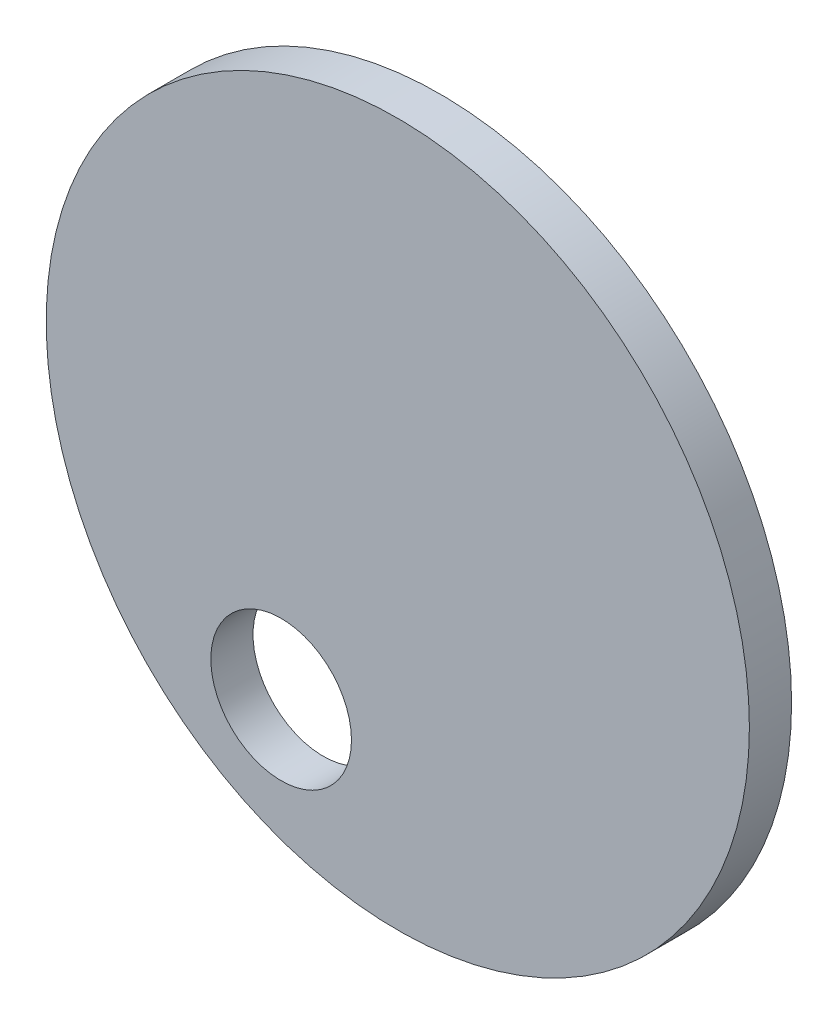
ISO-10303-21;
HEADER;
FILE_DESCRIPTION(('STEP AP214'),'2;1');
FILE_NAME('part.step','',(''),(''),'','','');
FILE_SCHEMA(('AUTOMOTIVE_DESIGN { 1 0 10303 214 1 1 1 1 }'));
ENDSEC;
DATA;
#1=APPLICATION_CONTEXT('core data for automotive mechanical design processes');
#2=APPLICATION_PROTOCOL_DEFINITION('international standard','automotive_design',2000,#1);
#3=PRODUCT_CONTEXT('',#1,'mechanical');
#4=PRODUCT('Part','Part','',(#3));
#5=PRODUCT_RELATED_PRODUCT_CATEGORY('part','',(#4));
#6=PRODUCT_DEFINITION_FORMATION('','',#4);
#7=PRODUCT_DEFINITION_CONTEXT('part definition',#1,'design');
#8=PRODUCT_DEFINITION('design','',#6,#7);
#9=PRODUCT_DEFINITION_SHAPE('','',#8);
#10=(LENGTH_UNIT() NAMED_UNIT(*) SI_UNIT(.MILLI.,.METRE.));
#11=(NAMED_UNIT(*) PLANE_ANGLE_UNIT() SI_UNIT($,.RADIAN.));
#12=(NAMED_UNIT(*) SI_UNIT($,.STERADIAN.) SOLID_ANGLE_UNIT());
#13=UNCERTAINTY_MEASURE_WITH_UNIT(LENGTH_MEASURE(1.E-05),#10,'distance_accuracy_value','');
#14=(GEOMETRIC_REPRESENTATION_CONTEXT(3) GLOBAL_UNCERTAINTY_ASSIGNED_CONTEXT((#13)) GLOBAL_UNIT_ASSIGNED_CONTEXT((#10,
#11,#12)) REPRESENTATION_CONTEXT('',''));
#15=CARTESIAN_POINT('',(0.,0.,0.));
#16=DIRECTION('',(0.,0.,1.));
#17=DIRECTION('',(1.,0.,0.));
#18=AXIS2_PLACEMENT_3D('',#15,#16,#17);
#19=CARTESIAN_POINT('',(0.,0.,0.));
#20=DIRECTION('',(0.,0.,1.));
#21=DIRECTION('',(1.,0.,0.));
#22=AXIS2_PLACEMENT_3D('',#19,#20,#21);
#23=PLANE('',#22);
#24=CARTESIAN_POINT('',(-8.29544599419522,-14.9408728904766,0.));
#25=DIRECTION('',(0.,0.,1.));
#26=DIRECTION('',(1.,0.,0.));
#27=AXIS2_PLACEMENT_3D('',#24,#25,#26);
#28=CIRCLE('',#27,5.00000000000001);
#29=CARTESIAN_POINT('',(-3.29544599419522,-14.9408728904766,0.));
#30=VERTEX_POINT('',#29);
#31=EDGE_CURVE('E91',#30,#30,#28,.T.);
#32=ORIENTED_EDGE('',*,*,#31,.T.);
#33=EDGE_LOOP('',(#32));
#34=FACE_BOUND('',#33,.T.);
#35=CARTESIAN_POINT('',(0.,0.,0.));
#36=DIRECTION('',(0.,0.,1.));
#37=DIRECTION('',(1.,0.,0.));
#38=AXIS2_PLACEMENT_3D('',#35,#36,#37);
#39=CIRCLE('',#38,25.);
#40=CARTESIAN_POINT('',(25.,0.,0.));
#41=VERTEX_POINT('',#40);
#42=EDGE_CURVE('E49',#41,#41,#39,.T.);
#43=ORIENTED_EDGE('',*,*,#42,.F.);
#44=EDGE_LOOP('',(#43));
#45=FACE_BOUND('',#44,.T.);
#46=CARTESIAN_POINT('',(0.,0.,0.));
#47=DIRECTION('',(0.,0.,-1.));
#48=DIRECTION('',(-1.,0.,0.));
#49=AXIS2_PLACEMENT_3D('',#46,#47,#48);
#50=CIRCLE('',#49,6.);
#51=CARTESIAN_POINT('',(-6.,0.,0.));
#52=VERTEX_POINT('',#51);
#53=EDGE_CURVE('E11',#52,#52,#50,.T.);
#54=ORIENTED_EDGE('',*,*,#53,.F.);
#55=EDGE_LOOP('',(#54));
#56=FACE_BOUND('',#55,.T.);
#57=ADVANCED_FACE('F45',(#34,#45,#56),#23,.F.);
#58=CARTESIAN_POINT('',(0.,0.,3.));
#59=DIRECTION('',(0.,0.,-1.));
#60=DIRECTION('',(-1.,0.,0.));
#61=AXIS2_PLACEMENT_3D('',#58,#59,#60);
#62=CYLINDRICAL_SURFACE('',#61,25.);
#63=CARTESIAN_POINT('',(0.,0.,3.));
#64=DIRECTION('',(0.,0.,1.));
#65=DIRECTION('',(1.,0.,0.));
#66=AXIS2_PLACEMENT_3D('',#63,#64,#65);
#67=CIRCLE('',#66,25.);
#68=CARTESIAN_POINT('',(25.,0.,3.));
#69=VERTEX_POINT('',#68);
#70=EDGE_CURVE('E55',#69,#69,#67,.T.);
#71=ORIENTED_EDGE('',*,*,#70,.F.);
#72=EDGE_LOOP('',(#71));
#73=FACE_BOUND('',#72,.T.);
#74=ORIENTED_EDGE('',*,*,#42,.T.);
#75=EDGE_LOOP('',(#74));
#76=FACE_BOUND('',#75,.T.);
#77=ADVANCED_FACE('F47',(#73,#76),#62,.T.);
#78=CARTESIAN_POINT('',(0.,0.,3.));
#79=DIRECTION('',(0.,0.,1.));
#80=DIRECTION('',(1.,0.,0.));
#81=AXIS2_PLACEMENT_3D('',#78,#79,#80);
#82=PLANE('',#81);
#83=CARTESIAN_POINT('',(-8.29544599419522,-14.9408728904766,3.));
#84=DIRECTION('',(0.,0.,1.));
#85=DIRECTION('',(1.,0.,0.));
#86=AXIS2_PLACEMENT_3D('',#83,#84,#85);
#87=CIRCLE('',#86,5.00000000000001);
#88=CARTESIAN_POINT('',(-3.29544599419522,-14.9408728904766,3.));
#89=VERTEX_POINT('',#88);
#90=EDGE_CURVE('E95',#89,#89,#87,.T.);
#91=ORIENTED_EDGE('',*,*,#90,.F.);
#92=EDGE_LOOP('',(#91));
#93=FACE_BOUND('',#92,.T.);
#94=ORIENTED_EDGE('',*,*,#70,.T.);
#95=EDGE_LOOP('',(#94));
#96=FACE_BOUND('',#95,.T.);
#97=ADVANCED_FACE('F129',(#93,#96),#82,.T.);
#98=CARTESIAN_POINT('',(0.,0.,-9.));
#99=DIRECTION('',(0.,0.,-1.));
#100=DIRECTION('',(-1.,0.,0.));
#101=AXIS2_PLACEMENT_3D('',#98,#99,#100);
#102=PLANE('',#101);
#103=CARTESIAN_POINT('',(0.,0.,-9.));
#104=DIRECTION('',(0.,0.,-1.));
#105=DIRECTION('',(-1.,0.,0.));
#106=AXIS2_PLACEMENT_3D('',#103,#104,#105);
#107=CIRCLE('',#106,6.);
#108=CARTESIAN_POINT('',(-6.,0.,-9.));
#109=VERTEX_POINT('',#108);
#110=EDGE_CURVE('E87',#109,#109,#107,.T.);
#111=ORIENTED_EDGE('',*,*,#110,.T.);
#112=EDGE_LOOP('',(#111));
#113=FACE_BOUND('',#112,.T.);
#114=DIRECTION('',(1.,0.,0.));
#115=VECTOR('',#114,1.);
#116=CARTESIAN_POINT('',(1.39731886124821,1.5,-9.));
#117=LINE('',#116,#115);
#118=CARTESIAN_POINT('',(-1.39731886124821,1.5,-9.));
#119=VERTEX_POINT('',#118);
#120=CARTESIAN_POINT('',(1.39731886124821,1.5,-9.));
#121=VERTEX_POINT('',#120);
#122=EDGE_CURVE('E98',#119,#121,#117,.T.);
#123=ORIENTED_EDGE('',*,*,#122,.F.);
#124=CARTESIAN_POINT('',(0.,0.,-9.));
#125=DIRECTION('',(0.,0.,-1.));
#126=DIRECTION('',(-1.,0.,0.));
#127=AXIS2_PLACEMENT_3D('',#124,#125,#126);
#128=CIRCLE('',#127,2.05);
#129=EDGE_CURVE('E79',#121,#119,#128,.T.);
#130=ORIENTED_EDGE('',*,*,#129,.F.);
#131=EDGE_LOOP('',(#123,#130));
#132=FACE_BOUND('',#131,.T.);
#133=ADVANCED_FACE('F121',(#113,#132),#102,.T.);
#134=CARTESIAN_POINT('',(0.,0.,-9.));
#135=DIRECTION('',(0.,0.,1.));
#136=DIRECTION('',(1.,0.,0.));
#137=AXIS2_PLACEMENT_3D('',#134,#135,#136);
#138=CYLINDRICAL_SURFACE('',#137,6.);
#139=ORIENTED_EDGE('',*,*,#110,.F.);
#140=EDGE_LOOP('',(#139));
#141=FACE_BOUND('',#140,.T.);
#142=ORIENTED_EDGE('',*,*,#53,.T.);
#143=EDGE_LOOP('',(#142));
#144=FACE_BOUND('',#143,.T.);
#145=ADVANCED_FACE('F119',(#141,#144),#138,.T.);
#146=CARTESIAN_POINT('',(0.,0.,-9.));
#147=DIRECTION('',(0.,0.,1.));
#148=DIRECTION('',(1.,0.,0.));
#149=AXIS2_PLACEMENT_3D('',#146,#147,#148);
#150=CYLINDRICAL_SURFACE('',#149,2.05);
#151=CARTESIAN_POINT('',(0.,0.,0.));
#152=DIRECTION('',(0.,0.,-1.));
#153=DIRECTION('',(-1.,0.,0.));
#154=AXIS2_PLACEMENT_3D('',#151,#152,#153);
#155=CIRCLE('',#154,2.05);
#156=CARTESIAN_POINT('',(1.39731886124821,1.5,0.));
#157=VERTEX_POINT('',#156);
#158=CARTESIAN_POINT('',(-1.39731886124821,1.5,0.));
#159=VERTEX_POINT('',#158);
#160=EDGE_CURVE('E80',#157,#159,#155,.T.);
#161=ORIENTED_EDGE('',*,*,#160,.F.);
#162=DIRECTION('',(0.,0.,1.));
#163=VECTOR('',#162,1.);
#164=CARTESIAN_POINT('',(1.39731886124821,1.5,-9.));
#165=LINE('',#164,#163);
#166=EDGE_CURVE('E63',#121,#157,#165,.T.);
#167=ORIENTED_EDGE('',*,*,#166,.F.);
#168=ORIENTED_EDGE('',*,*,#129,.T.);
#169=DIRECTION('',(0.,0.,1.));
#170=VECTOR('',#169,1.);
#171=CARTESIAN_POINT('',(-1.39731886124821,1.5,-9.));
#172=LINE('',#171,#170);
#173=EDGE_CURVE('E68',#119,#159,#172,.T.);
#174=ORIENTED_EDGE('',*,*,#173,.T.);
#175=EDGE_LOOP('',(#161,#167,#168,#174));
#176=FACE_BOUND('',#175,.T.);
#177=ADVANCED_FACE('F83',(#176),#150,.F.);
#178=CARTESIAN_POINT('',(1.39731886124821,1.5,-9.));
#179=DIRECTION('',(0.,-1.,0.));
#180=DIRECTION('',(0.,0.,-1.));
#181=AXIS2_PLACEMENT_3D('',#178,#179,#180);
#182=PLANE('',#181);
#183=DIRECTION('',(1.,0.,0.));
#184=VECTOR('',#183,1.);
#185=CARTESIAN_POINT('',(1.39731886124821,1.5,0.));
#186=LINE('',#185,#184);
#187=EDGE_CURVE('E74',#159,#157,#186,.T.);
#188=ORIENTED_EDGE('',*,*,#187,.F.);
#189=ORIENTED_EDGE('',*,*,#173,.F.);
#190=ORIENTED_EDGE('',*,*,#122,.T.);
#191=ORIENTED_EDGE('',*,*,#166,.T.);
#192=EDGE_LOOP('',(#188,#189,#190,#191));
#193=FACE_BOUND('',#192,.T.);
#194=ADVANCED_FACE('F75',(#193),#182,.T.);
#195=ORIENTED_EDGE('',*,*,#187,.T.);
#196=ORIENTED_EDGE('',*,*,#160,.T.);
#197=EDGE_LOOP('',(#195,#196));
#198=FACE_BOUND('',#197,.T.);
#199=ADVANCED_FACE('F89',(#198),#23,.F.);
#200=CARTESIAN_POINT('',(-8.29544599419522,-14.9408728904766,-2.));
#201=DIRECTION('',(0.,0.,1.));
#202=DIRECTION('',(1.,0.,0.));
#203=AXIS2_PLACEMENT_3D('',#200,#201,#202);
#204=CYLINDRICAL_SURFACE('',#203,5.00000000000001);
#205=ORIENTED_EDGE('',*,*,#90,.T.);
#206=EDGE_LOOP('',(#205));
#207=FACE_BOUND('',#206,.T.);
#208=ORIENTED_EDGE('',*,*,#31,.F.);
#209=EDGE_LOOP('',(#208));
#210=FACE_BOUND('',#209,.T.);
#211=ADVANCED_FACE('F137',(#207,#210),#204,.F.);
#212=CLOSED_SHELL('',(#57,#77,#97,#133,#145,#177,#194,#199,#211));
#213=MANIFOLD_SOLID_BREP('B2',#212);
#214=ADVANCED_BREP_SHAPE_REPRESENTATION('',(#18,#213),#14);
#215=SHAPE_DEFINITION_REPRESENTATION(#9,#214);
ENDSEC;
END-ISO-10303-21;
